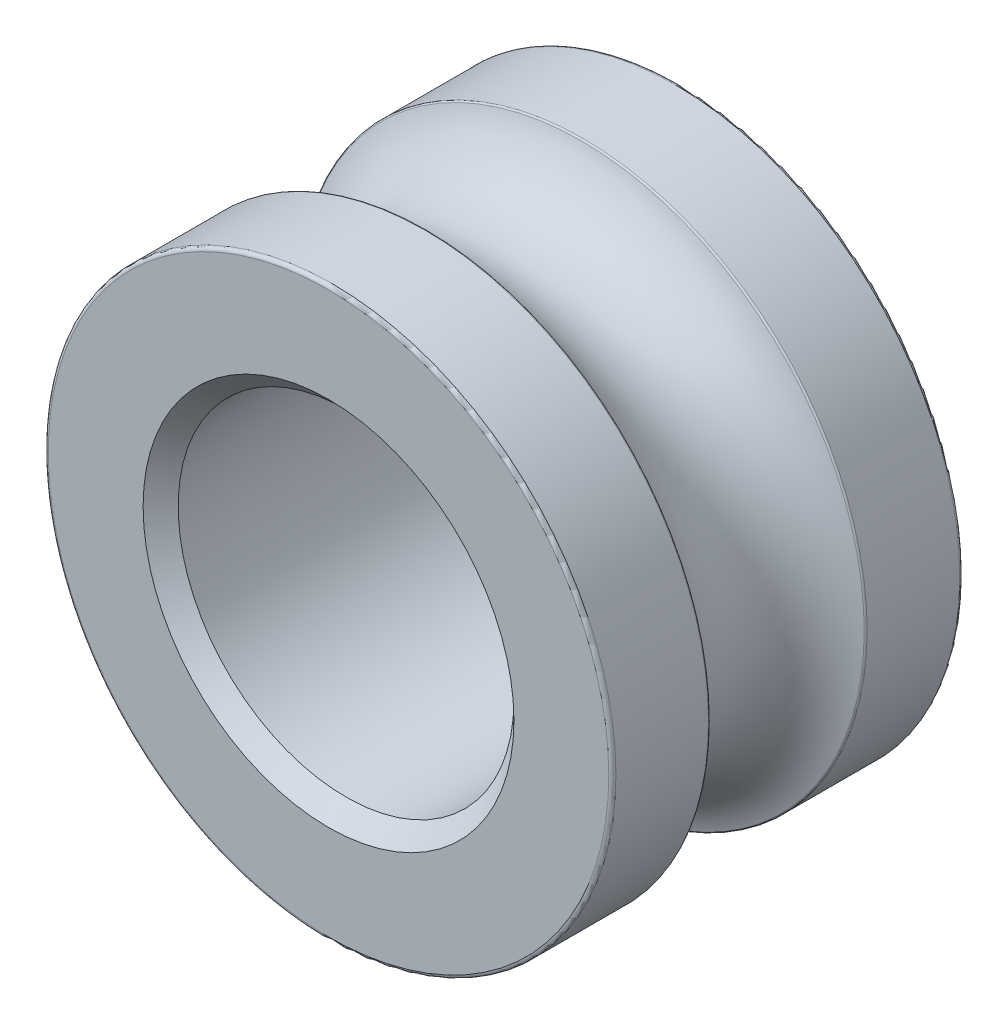
ISO-10303-21;
HEADER;
FILE_DESCRIPTION(('STEP AP214'),'2;1');
FILE_NAME('part.step','',(''),(''),'','','');
FILE_SCHEMA(('AUTOMOTIVE_DESIGN { 1 0 10303 214 1 1 1 1 }'));
ENDSEC;
DATA;
#1=APPLICATION_CONTEXT('core data for automotive mechanical design processes');
#2=APPLICATION_PROTOCOL_DEFINITION('international standard','automotive_design',2000,#1);
#3=PRODUCT_CONTEXT('',#1,'mechanical');
#4=PRODUCT('Part','Part','',(#3));
#5=PRODUCT_RELATED_PRODUCT_CATEGORY('part','',(#4));
#6=PRODUCT_DEFINITION_FORMATION('','',#4);
#7=PRODUCT_DEFINITION_CONTEXT('part definition',#1,'design');
#8=PRODUCT_DEFINITION('design','',#6,#7);
#9=PRODUCT_DEFINITION_SHAPE('','',#8);
#10=(LENGTH_UNIT() NAMED_UNIT(*) SI_UNIT(.MILLI.,.METRE.));
#11=(NAMED_UNIT(*) PLANE_ANGLE_UNIT() SI_UNIT($,.RADIAN.));
#12=(NAMED_UNIT(*) SI_UNIT($,.STERADIAN.) SOLID_ANGLE_UNIT());
#13=UNCERTAINTY_MEASURE_WITH_UNIT(LENGTH_MEASURE(1.E-05),#10,'distance_accuracy_value','');
#14=(GEOMETRIC_REPRESENTATION_CONTEXT(3) GLOBAL_UNCERTAINTY_ASSIGNED_CONTEXT((#13)) GLOBAL_UNIT_ASSIGNED_CONTEXT((#10,
#11,#12)) REPRESENTATION_CONTEXT('',''));
#15=CARTESIAN_POINT('',(0.,0.,0.));
#16=DIRECTION('',(0.,0.,1.));
#17=DIRECTION('',(1.,0.,0.));
#18=AXIS2_PLACEMENT_3D('',#15,#16,#17);
#19=CARTESIAN_POINT('',(0.,0.,-1.12493032019577));
#20=DIRECTION('',(0.,0.,1.));
#21=DIRECTION('',(1.,0.,0.));
#22=AXIS2_PLACEMENT_3D('',#19,#20,#21);
#23=TOROIDAL_SURFACE('',#22,4.00081401098901,0.0254);
#24=CARTESIAN_POINT('',(0.,0.,-1.10076906346745));
#25=DIRECTION('',(0.,0.,1.));
#26=DIRECTION('',(1.,0.,0.));
#27=AXIS2_PLACEMENT_3D('',#24,#25,#26);
#28=CIRCLE('',#27,4.00864942248479);
#29=CARTESIAN_POINT('',(4.00864942248479,0.,-1.10076906346745));
#30=VERTEX_POINT('',#29);
#31=EDGE_CURVE('E10',#30,#30,#28,.T.);
#32=ORIENTED_EDGE('',*,*,#31,.F.);
#33=EDGE_LOOP('',(#32));
#34=FACE_BOUND('',#33,.T.);
#35=CARTESIAN_POINT('',(0.,0.,-1.12493032019577));
#36=DIRECTION('',(0.,0.,1.));
#37=DIRECTION('',(1.,0.,0.));
#38=AXIS2_PLACEMENT_3D('',#35,#36,#37);
#39=CIRCLE('',#38,4.02621401098901);
#40=CARTESIAN_POINT('',(4.02621401098901,0.,-1.12493032019577));
#41=VERTEX_POINT('',#40);
#42=EDGE_CURVE('E74',#41,#41,#39,.T.);
#43=ORIENTED_EDGE('',*,*,#42,.T.);
#44=EDGE_LOOP('',(#43));
#45=FACE_BOUND('',#44,.T.);
#46=ADVANCED_FACE('F34',(#34,#45),#23,.T.);
#47=CARTESIAN_POINT('',(0.,0.,0.));
#48=DIRECTION('',(0.,0.,1.));
#49=DIRECTION('',(1.,0.,0.));
#50=AXIS2_PLACEMENT_3D('',#47,#48,#49);
#51=TOROIDAL_SURFACE('',#50,4.365625,1.15720529467736);
#52=CARTESIAN_POINT('',(0.,0.,1.10076906346745));
#53=DIRECTION('',(0.,0.,1.));
#54=DIRECTION('',(1.,0.,0.));
#55=AXIS2_PLACEMENT_3D('',#52,#53,#54);
#56=CIRCLE('',#55,4.00864942248479);
#57=CARTESIAN_POINT('',(4.00864942248479,0.,1.10076906346745));
#58=VERTEX_POINT('',#57);
#59=EDGE_CURVE('E40',#58,#58,#56,.T.);
#60=ORIENTED_EDGE('',*,*,#59,.F.);
#61=EDGE_LOOP('',(#60));
#62=FACE_BOUND('',#61,.T.);
#63=ORIENTED_EDGE('',*,*,#31,.T.);
#64=EDGE_LOOP('',(#63));
#65=FACE_BOUND('',#64,.T.);
#66=ADVANCED_FACE('F135',(#62,#65),#51,.F.);
#67=CARTESIAN_POINT('',(0.,0.,1.12493032019577));
#68=DIRECTION('',(0.,0.,1.));
#69=DIRECTION('',(1.,0.,0.));
#70=AXIS2_PLACEMENT_3D('',#67,#68,#69);
#71=TOROIDAL_SURFACE('',#70,4.00081401098901,0.0254);
#72=CARTESIAN_POINT('',(0.,0.,1.12493032019577));
#73=DIRECTION('',(0.,0.,1.));
#74=DIRECTION('',(1.,0.,0.));
#75=AXIS2_PLACEMENT_3D('',#72,#73,#74);
#76=CIRCLE('',#75,4.02621401098901);
#77=CARTESIAN_POINT('',(4.02621401098901,0.,1.12493032019577));
#78=VERTEX_POINT('',#77);
#79=EDGE_CURVE('E44',#78,#78,#76,.T.);
#80=ORIENTED_EDGE('',*,*,#79,.F.);
#81=EDGE_LOOP('',(#80));
#82=FACE_BOUND('',#81,.T.);
#83=ORIENTED_EDGE('',*,*,#59,.T.);
#84=EDGE_LOOP('',(#83));
#85=FACE_BOUND('',#84,.T.);
#86=ADVANCED_FACE('F130',(#82,#85),#71,.T.);
#87=CARTESIAN_POINT('',(0.,0.,2.4892));
#88=DIRECTION('',(0.,0.,1.));
#89=DIRECTION('',(1.,0.,0.));
#90=AXIS2_PLACEMENT_3D('',#87,#88,#89);
#91=CYLINDRICAL_SURFACE('',#90,4.02621401098901);
#92=CARTESIAN_POINT('',(0.,0.,2.4384));
#93=DIRECTION('',(0.,0.,1.));
#94=DIRECTION('',(1.,0.,0.));
#95=AXIS2_PLACEMENT_3D('',#92,#93,#94);
#96=CIRCLE('',#95,4.02621401098901);
#97=CARTESIAN_POINT('',(4.02621401098901,0.,2.4384));
#98=VERTEX_POINT('',#97);
#99=EDGE_CURVE('E48',#98,#98,#96,.T.);
#100=ORIENTED_EDGE('',*,*,#99,.F.);
#101=EDGE_LOOP('',(#100));
#102=FACE_BOUND('',#101,.T.);
#103=ORIENTED_EDGE('',*,*,#79,.T.);
#104=EDGE_LOOP('',(#103));
#105=FACE_BOUND('',#104,.T.);
#106=ADVANCED_FACE('F124',(#102,#105),#91,.T.);
#107=CARTESIAN_POINT('',(0.,0.,2.4384));
#108=DIRECTION('',(0.,0.,1.));
#109=DIRECTION('',(1.,0.,0.));
#110=AXIS2_PLACEMENT_3D('',#107,#108,#109);
#111=TOROIDAL_SURFACE('',#110,3.97541401098901,0.0508000000000002);
#112=CARTESIAN_POINT('',(0.,0.,2.4892));
#113=DIRECTION('',(0.,0.,1.));
#114=DIRECTION('',(1.,0.,0.));
#115=AXIS2_PLACEMENT_3D('',#112,#113,#114);
#116=CIRCLE('',#115,3.97541401098901);
#117=CARTESIAN_POINT('',(3.97541401098901,0.,2.4892));
#118=VERTEX_POINT('',#117);
#119=EDGE_CURVE('E53',#118,#118,#116,.T.);
#120=ORIENTED_EDGE('',*,*,#119,.F.);
#121=EDGE_LOOP('',(#120));
#122=FACE_BOUND('',#121,.T.);
#123=ORIENTED_EDGE('',*,*,#99,.T.);
#124=EDGE_LOOP('',(#123));
#125=FACE_BOUND('',#124,.T.);
#126=ADVANCED_FACE('F118',(#122,#125),#111,.T.);
#127=CARTESIAN_POINT('',(0.,2.63017,2.4892));
#128=DIRECTION('',(0.,0.,-1.));
#129=DIRECTION('',(-1.,0.,0.));
#130=AXIS2_PLACEMENT_3D('',#127,#128,#129);
#131=PLANE('',#130);
#132=CARTESIAN_POINT('',(0.,0.,2.4892));
#133=DIRECTION('',(0.,0.,1.));
#134=DIRECTION('',(1.,0.,0.));
#135=AXIS2_PLACEMENT_3D('',#132,#133,#134);
#136=CIRCLE('',#135,2.63017);
#137=CARTESIAN_POINT('',(2.63017,0.,2.4892));
#138=VERTEX_POINT('',#137);
#139=EDGE_CURVE('E56',#138,#138,#136,.T.);
#140=ORIENTED_EDGE('',*,*,#139,.F.);
#141=EDGE_LOOP('',(#140));
#142=FACE_BOUND('',#141,.T.);
#143=ORIENTED_EDGE('',*,*,#119,.T.);
#144=EDGE_LOOP('',(#143));
#145=FACE_BOUND('',#144,.T.);
#146=ADVANCED_FACE('F112',(#142,#145),#131,.F.);
#147=CARTESIAN_POINT('',(0.,0.,2.4892));
#148=DIRECTION('',(0.,0.,1.));
#149=DIRECTION('',(1.,0.,0.));
#150=AXIS2_PLACEMENT_3D('',#147,#148,#149);
#151=CONICAL_SURFACE('',#150,2.63017,0.78539816339745);
#152=CARTESIAN_POINT('',(0.,0.,2.24028));
#153=DIRECTION('',(0.,0.,1.));
#154=DIRECTION('',(1.,0.,0.));
#155=AXIS2_PLACEMENT_3D('',#152,#153,#154);
#156=CIRCLE('',#155,2.38125);
#157=CARTESIAN_POINT('',(2.38125,0.,2.24028));
#158=VERTEX_POINT('',#157);
#159=EDGE_CURVE('E59',#158,#158,#156,.T.);
#160=ORIENTED_EDGE('',*,*,#159,.F.);
#161=EDGE_LOOP('',(#160));
#162=FACE_BOUND('',#161,.T.);
#163=ORIENTED_EDGE('',*,*,#139,.T.);
#164=EDGE_LOOP('',(#163));
#165=FACE_BOUND('',#164,.T.);
#166=ADVANCED_FACE('F106',(#162,#165),#151,.F.);
#167=CARTESIAN_POINT('',(0.,0.,2.4892));
#168=DIRECTION('',(0.,0.,1.));
#169=DIRECTION('',(1.,0.,0.));
#170=AXIS2_PLACEMENT_3D('',#167,#168,#169);
#171=CYLINDRICAL_SURFACE('',#170,2.38125);
#172=CARTESIAN_POINT('',(0.,0.,-2.24028));
#173=DIRECTION('',(0.,0.,1.));
#174=DIRECTION('',(1.,0.,0.));
#175=AXIS2_PLACEMENT_3D('',#172,#173,#174);
#176=CIRCLE('',#175,2.38125);
#177=CARTESIAN_POINT('',(2.38125,0.,-2.24028));
#178=VERTEX_POINT('',#177);
#179=EDGE_CURVE('E62',#178,#178,#176,.T.);
#180=ORIENTED_EDGE('',*,*,#179,.F.);
#181=EDGE_LOOP('',(#180));
#182=FACE_BOUND('',#181,.T.);
#183=ORIENTED_EDGE('',*,*,#159,.T.);
#184=EDGE_LOOP('',(#183));
#185=FACE_BOUND('',#184,.T.);
#186=ADVANCED_FACE('F100',(#182,#185),#171,.F.);
#187=CARTESIAN_POINT('',(0.,0.,-2.24028));
#188=DIRECTION('',(0.,0.,-1.));
#189=DIRECTION('',(-1.,0.,0.));
#190=AXIS2_PLACEMENT_3D('',#187,#188,#189);
#191=CONICAL_SURFACE('',#190,2.38125,0.785398163397447);
#192=CARTESIAN_POINT('',(0.,0.,-2.4892));
#193=DIRECTION('',(0.,0.,1.));
#194=DIRECTION('',(1.,0.,0.));
#195=AXIS2_PLACEMENT_3D('',#192,#193,#194);
#196=CIRCLE('',#195,2.63017);
#197=CARTESIAN_POINT('',(2.63017,0.,-2.4892));
#198=VERTEX_POINT('',#197);
#199=EDGE_CURVE('E65',#198,#198,#196,.T.);
#200=ORIENTED_EDGE('',*,*,#199,.F.);
#201=EDGE_LOOP('',(#200));
#202=FACE_BOUND('',#201,.T.);
#203=ORIENTED_EDGE('',*,*,#179,.T.);
#204=EDGE_LOOP('',(#203));
#205=FACE_BOUND('',#204,.T.);
#206=ADVANCED_FACE('F94',(#202,#205),#191,.F.);
#207=CARTESIAN_POINT('',(0.,2.63017,-2.4892));
#208=DIRECTION('',(0.,0.,1.));
#209=DIRECTION('',(1.,0.,0.));
#210=AXIS2_PLACEMENT_3D('',#207,#208,#209);
#211=PLANE('',#210);
#212=CARTESIAN_POINT('',(0.,0.,-2.4892));
#213=DIRECTION('',(0.,0.,1.));
#214=DIRECTION('',(1.,0.,0.));
#215=AXIS2_PLACEMENT_3D('',#212,#213,#214);
#216=CIRCLE('',#215,3.97541401098901);
#217=CARTESIAN_POINT('',(3.97541401098901,0.,-2.4892));
#218=VERTEX_POINT('',#217);
#219=EDGE_CURVE('E68',#218,#218,#216,.T.);
#220=ORIENTED_EDGE('',*,*,#219,.F.);
#221=EDGE_LOOP('',(#220));
#222=FACE_BOUND('',#221,.T.);
#223=ORIENTED_EDGE('',*,*,#199,.T.);
#224=EDGE_LOOP('',(#223));
#225=FACE_BOUND('',#224,.T.);
#226=ADVANCED_FACE('F88',(#222,#225),#211,.F.);
#227=CARTESIAN_POINT('',(0.,0.,-2.4384));
#228=DIRECTION('',(0.,0.,1.));
#229=DIRECTION('',(1.,0.,0.));
#230=AXIS2_PLACEMENT_3D('',#227,#228,#229);
#231=TOROIDAL_SURFACE('',#230,3.97541401098901,0.0508000000000002);
#232=CARTESIAN_POINT('',(0.,0.,-2.4384));
#233=DIRECTION('',(0.,0.,1.));
#234=DIRECTION('',(1.,0.,0.));
#235=AXIS2_PLACEMENT_3D('',#232,#233,#234);
#236=CIRCLE('',#235,4.02621401098901);
#237=CARTESIAN_POINT('',(4.02621401098901,0.,-2.4384));
#238=VERTEX_POINT('',#237);
#239=EDGE_CURVE('E71',#238,#238,#236,.T.);
#240=ORIENTED_EDGE('',*,*,#239,.F.);
#241=EDGE_LOOP('',(#240));
#242=FACE_BOUND('',#241,.T.);
#243=ORIENTED_EDGE('',*,*,#219,.T.);
#244=EDGE_LOOP('',(#243));
#245=FACE_BOUND('',#244,.T.);
#246=ADVANCED_FACE('F82',(#242,#245),#231,.T.);
#247=CARTESIAN_POINT('',(0.,0.,2.4892));
#248=DIRECTION('',(0.,0.,1.));
#249=DIRECTION('',(1.,0.,0.));
#250=AXIS2_PLACEMENT_3D('',#247,#248,#249);
#251=CYLINDRICAL_SURFACE('',#250,4.02621401098901);
#252=ORIENTED_EDGE('',*,*,#42,.F.);
#253=EDGE_LOOP('',(#252));
#254=FACE_BOUND('',#253,.T.);
#255=ORIENTED_EDGE('',*,*,#239,.T.);
#256=EDGE_LOOP('',(#255));
#257=FACE_BOUND('',#256,.T.);
#258=ADVANCED_FACE('F79',(#254,#257),#251,.T.);
#259=CLOSED_SHELL('',(#46,#66,#86,#106,#126,#146,#166,#186,#206,#226,#246,#258));
#260=MANIFOLD_SOLID_BREP('B2',#259);
#261=ADVANCED_BREP_SHAPE_REPRESENTATION('',(#18,#260),#14);
#262=SHAPE_DEFINITION_REPRESENTATION(#9,#261);
ENDSEC;
END-ISO-10303-21;
